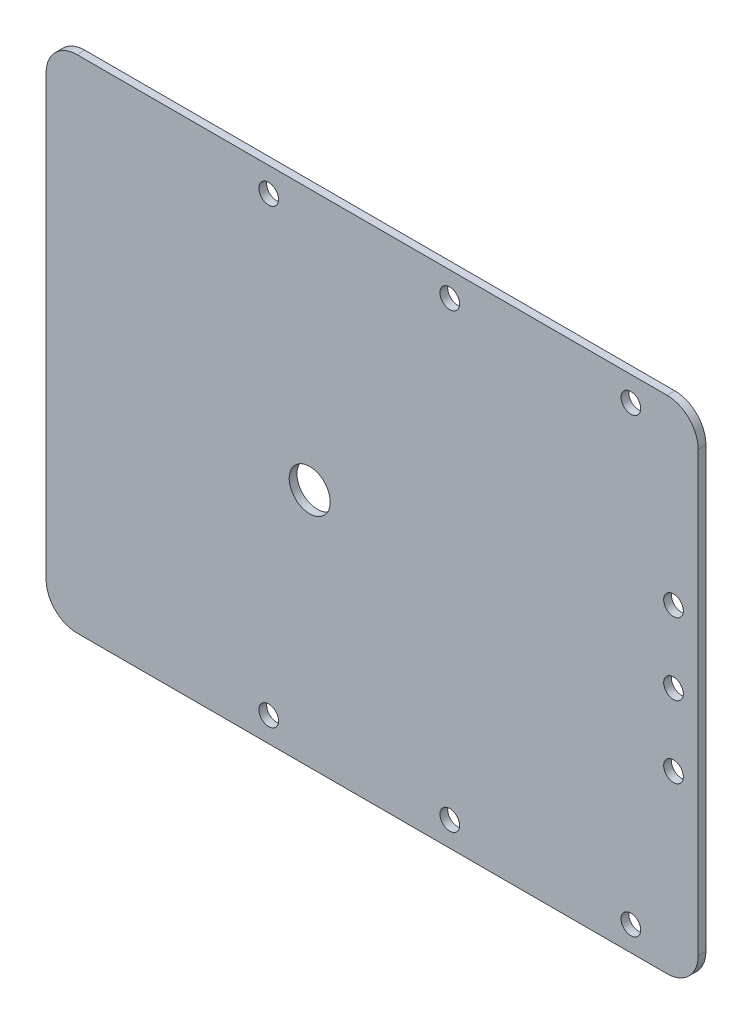
ISO-10303-21;
HEADER;
FILE_DESCRIPTION(('STEP AP214'),'2;1');
FILE_NAME('part.step','',(''),(''),'','','');
FILE_SCHEMA(('AUTOMOTIVE_DESIGN { 1 0 10303 214 1 1 1 1 }'));
ENDSEC;
DATA;
#1=APPLICATION_CONTEXT('core data for automotive mechanical design processes');
#2=APPLICATION_PROTOCOL_DEFINITION('international standard','automotive_design',2000,#1);
#3=PRODUCT_CONTEXT('',#1,'mechanical');
#4=PRODUCT('Part','Part','',(#3));
#5=PRODUCT_RELATED_PRODUCT_CATEGORY('part','',(#4));
#6=PRODUCT_DEFINITION_FORMATION('','',#4);
#7=PRODUCT_DEFINITION_CONTEXT('part definition',#1,'design');
#8=PRODUCT_DEFINITION('design','',#6,#7);
#9=PRODUCT_DEFINITION_SHAPE('','',#8);
#10=(LENGTH_UNIT() NAMED_UNIT(*) SI_UNIT(.MILLI.,.METRE.));
#11=(NAMED_UNIT(*) PLANE_ANGLE_UNIT() SI_UNIT($,.RADIAN.));
#12=(NAMED_UNIT(*) SI_UNIT($,.STERADIAN.) SOLID_ANGLE_UNIT());
#13=UNCERTAINTY_MEASURE_WITH_UNIT(LENGTH_MEASURE(1.E-05),#10,'distance_accuracy_value','');
#14=(GEOMETRIC_REPRESENTATION_CONTEXT(3) GLOBAL_UNCERTAINTY_ASSIGNED_CONTEXT((#13)) GLOBAL_UNIT_ASSIGNED_CONTEXT((#10,
#11,#12)) REPRESENTATION_CONTEXT('',''));
#15=CARTESIAN_POINT('',(0.,0.,0.));
#16=DIRECTION('',(0.,0.,1.));
#17=DIRECTION('',(1.,0.,0.));
#18=AXIS2_PLACEMENT_3D('',#15,#16,#17);
#19=CARTESIAN_POINT('',(59.5125,-52.775,1.5));
#20=DIRECTION('',(0.,0.,1.));
#21=DIRECTION('',(1.,0.,0.));
#22=AXIS2_PLACEMENT_3D('',#19,#20,#21);
#23=CYLINDRICAL_SURFACE('',#22,1.89864999999999);
#24=CARTESIAN_POINT('',(59.5125,-52.775,0.));
#25=DIRECTION('',(0.,0.,1.));
#26=DIRECTION('',(1.,0.,0.));
#27=AXIS2_PLACEMENT_3D('',#24,#25,#26);
#28=CIRCLE('',#27,1.89865);
#29=CARTESIAN_POINT('',(61.41115,-52.775,0.));
#30=VERTEX_POINT('',#29);
#31=EDGE_CURVE('E157',#30,#30,#28,.T.);
#32=ORIENTED_EDGE('',*,*,#31,.F.);
#33=EDGE_LOOP('',(#32));
#34=FACE_BOUND('',#33,.T.);
#35=CARTESIAN_POINT('',(59.5125,-52.775,1.5));
#36=DIRECTION('',(0.,0.,1.));
#37=DIRECTION('',(1.,0.,0.));
#38=AXIS2_PLACEMENT_3D('',#35,#36,#37);
#39=CIRCLE('',#38,1.89864999999999);
#40=CARTESIAN_POINT('',(61.41115,-52.775,1.5));
#41=VERTEX_POINT('',#40);
#42=EDGE_CURVE('E497',#41,#41,#39,.T.);
#43=ORIENTED_EDGE('',*,*,#42,.T.);
#44=EDGE_LOOP('',(#43));
#45=FACE_BOUND('',#44,.T.);
#46=ADVANCED_FACE('F39',(#34,#45),#23,.F.);
#47=CARTESIAN_POINT('',(-18.725,4.7625,1.5));
#48=DIRECTION('',(0.,0.,1.));
#49=DIRECTION('',(1.,0.,0.));
#50=AXIS2_PLACEMENT_3D('',#47,#48,#49);
#51=CYLINDRICAL_SURFACE('',#50,1.89864999999999);
#52=CARTESIAN_POINT('',(-18.725,4.7625,0.));
#53=DIRECTION('',(0.,0.,1.));
#54=DIRECTION('',(1.,0.,0.));
#55=AXIS2_PLACEMENT_3D('',#52,#53,#54);
#56=CIRCLE('',#55,1.89865);
#57=CARTESIAN_POINT('',(-16.82635,4.7625,0.));
#58=VERTEX_POINT('',#57);
#59=EDGE_CURVE('E150',#58,#58,#56,.T.);
#60=ORIENTED_EDGE('',*,*,#59,.F.);
#61=EDGE_LOOP('',(#60));
#62=FACE_BOUND('',#61,.T.);
#63=CARTESIAN_POINT('',(-18.725,4.7625,1.5));
#64=DIRECTION('',(0.,0.,1.));
#65=DIRECTION('',(1.,0.,0.));
#66=AXIS2_PLACEMENT_3D('',#63,#64,#65);
#67=CIRCLE('',#66,1.89864999999999);
#68=CARTESIAN_POINT('',(-16.82635,4.7625,1.5));
#69=VERTEX_POINT('',#68);
#70=EDGE_CURVE('E153',#69,#69,#67,.T.);
#71=ORIENTED_EDGE('',*,*,#70,.T.);
#72=EDGE_LOOP('',(#71));
#73=FACE_BOUND('',#72,.T.);
#74=ADVANCED_FACE('F300',(#62,#73),#51,.F.);
#75=CARTESIAN_POINT('',(-61.75,9.525,1.5));
#76=DIRECTION('',(1.,0.,0.));
#77=DIRECTION('',(0.,0.,-1.));
#78=AXIS2_PLACEMENT_3D('',#75,#76,#77);
#79=PLANE('',#78);
#80=DIRECTION('',(0.,-1.,0.));
#81=VECTOR('',#80,1.);
#82=CARTESIAN_POINT('',(-61.75,9.525,1.5));
#83=LINE('',#82,#81);
#84=CARTESIAN_POINT('',(-61.75,3.525,1.5));
#85=VERTEX_POINT('',#84);
#86=CARTESIAN_POINT('',(-61.75,-81.3,1.5));
#87=VERTEX_POINT('',#86);
#88=EDGE_CURVE('E125',#85,#87,#83,.T.);
#89=ORIENTED_EDGE('',*,*,#88,.F.);
#90=DIRECTION('',(0.,0.,-1.));
#91=VECTOR('',#90,1.);
#92=CARTESIAN_POINT('',(-61.75,3.525,1.5));
#93=LINE('',#92,#91);
#94=CARTESIAN_POINT('',(-61.75,3.525,0.));
#95=VERTEX_POINT('',#94);
#96=EDGE_CURVE('E109',#85,#95,#93,.T.);
#97=ORIENTED_EDGE('',*,*,#96,.T.);
#98=DIRECTION('',(0.,-1.,0.));
#99=VECTOR('',#98,1.);
#100=CARTESIAN_POINT('',(-61.75,9.525,0.));
#101=LINE('',#100,#99);
#102=CARTESIAN_POINT('',(-61.75,-81.3,0.));
#103=VERTEX_POINT('',#102);
#104=EDGE_CURVE('E122',#95,#103,#101,.T.);
#105=ORIENTED_EDGE('',*,*,#104,.T.);
#106=DIRECTION('',(0.,0.,-1.));
#107=VECTOR('',#106,1.);
#108=CARTESIAN_POINT('',(-61.75,-81.3,1.5));
#109=LINE('',#108,#107);
#110=EDGE_CURVE('E127',#103,#87,#109,.F.);
#111=ORIENTED_EDGE('',*,*,#110,.T.);
#112=EDGE_LOOP('',(#89,#97,#105,#111));
#113=FACE_BOUND('',#112,.T.);
#114=ADVANCED_FACE('F121',(#113),#79,.F.);
#115=CARTESIAN_POINT('',(-61.75,-87.3,1.5));
#116=DIRECTION('',(0.,1.,0.));
#117=DIRECTION('',(0.,0.,1.));
#118=AXIS2_PLACEMENT_3D('',#115,#116,#117);
#119=PLANE('',#118);
#120=DIRECTION('',(1.,0.,0.));
#121=VECTOR('',#120,1.);
#122=CARTESIAN_POINT('',(-61.75,-87.3,0.));
#123=LINE('',#122,#121);
#124=CARTESIAN_POINT('',(-55.75,-87.3,0.));
#125=VERTEX_POINT('',#124);
#126=CARTESIAN_POINT('',(58.275,-87.3,0.));
#127=VERTEX_POINT('',#126);
#128=EDGE_CURVE('E133',#125,#127,#123,.T.);
#129=ORIENTED_EDGE('',*,*,#128,.T.);
#130=DIRECTION('',(0.,0.,-1.));
#131=VECTOR('',#130,1.);
#132=CARTESIAN_POINT('',(58.275,-87.3,1.5));
#133=LINE('',#132,#131);
#134=CARTESIAN_POINT('',(58.275,-87.3,1.5));
#135=VERTEX_POINT('',#134);
#136=EDGE_CURVE('E12',#127,#135,#133,.F.);
#137=ORIENTED_EDGE('',*,*,#136,.T.);
#138=DIRECTION('',(1.,0.,0.));
#139=VECTOR('',#138,1.);
#140=CARTESIAN_POINT('',(-61.75,-87.3,1.5));
#141=LINE('',#140,#139);
#142=CARTESIAN_POINT('',(-55.75,-87.3,1.5));
#143=VERTEX_POINT('',#142);
#144=EDGE_CURVE('E178',#143,#135,#141,.T.);
#145=ORIENTED_EDGE('',*,*,#144,.F.);
#146=DIRECTION('',(0.,0.,-1.));
#147=VECTOR('',#146,1.);
#148=CARTESIAN_POINT('',(-55.75,-87.3,1.5));
#149=LINE('',#148,#147);
#150=EDGE_CURVE('E47',#143,#125,#149,.T.);
#151=ORIENTED_EDGE('',*,*,#150,.T.);
#152=EDGE_LOOP('',(#129,#137,#145,#151));
#153=FACE_BOUND('',#152,.T.);
#154=ADVANCED_FACE('F330',(#153),#119,.F.);
#155=CARTESIAN_POINT('',(64.275,9.525,1.5));
#156=DIRECTION('',(-1.,0.,0.));
#157=DIRECTION('',(0.,0.,1.));
#158=AXIS2_PLACEMENT_3D('',#155,#156,#157);
#159=PLANE('',#158);
#160=DIRECTION('',(0.,1.,0.));
#161=VECTOR('',#160,1.);
#162=CARTESIAN_POINT('',(64.275,9.525,1.5));
#163=LINE('',#162,#161);
#164=CARTESIAN_POINT('',(64.275,-81.3,1.5));
#165=VERTEX_POINT('',#164);
#166=CARTESIAN_POINT('',(64.275,3.525,1.5));
#167=VERTEX_POINT('',#166);
#168=EDGE_CURVE('E180',#165,#167,#163,.T.);
#169=ORIENTED_EDGE('',*,*,#168,.F.);
#170=DIRECTION('',(0.,0.,-1.));
#171=VECTOR('',#170,1.);
#172=CARTESIAN_POINT('',(64.275,-81.3,1.5));
#173=LINE('',#172,#171);
#174=CARTESIAN_POINT('',(64.275,-81.3,0.));
#175=VERTEX_POINT('',#174);
#176=EDGE_CURVE('E192',#165,#175,#173,.T.);
#177=ORIENTED_EDGE('',*,*,#176,.T.);
#178=DIRECTION('',(0.,1.,0.));
#179=VECTOR('',#178,1.);
#180=CARTESIAN_POINT('',(64.275,9.525,0.));
#181=LINE('',#180,#179);
#182=CARTESIAN_POINT('',(64.275,3.525,0.));
#183=VERTEX_POINT('',#182);
#184=EDGE_CURVE('E137',#175,#183,#181,.T.);
#185=ORIENTED_EDGE('',*,*,#184,.T.);
#186=DIRECTION('',(0.,0.,-1.));
#187=VECTOR('',#186,1.);
#188=CARTESIAN_POINT('',(64.275,3.525,1.5));
#189=LINE('',#188,#187);
#190=EDGE_CURVE('E54',#183,#167,#189,.F.);
#191=ORIENTED_EDGE('',*,*,#190,.T.);
#192=EDGE_LOOP('',(#169,#177,#185,#191));
#193=FACE_BOUND('',#192,.T.);
#194=ADVANCED_FACE('F335',(#193),#159,.F.);
#195=CARTESIAN_POINT('',(-61.75,9.525,1.5));
#196=DIRECTION('',(0.,-1.,0.));
#197=DIRECTION('',(0.,0.,-1.));
#198=AXIS2_PLACEMENT_3D('',#195,#196,#197);
#199=PLANE('',#198);
#200=DIRECTION('',(-1.,0.,0.));
#201=VECTOR('',#200,1.);
#202=CARTESIAN_POINT('',(-61.75,9.525,0.));
#203=LINE('',#202,#201);
#204=CARTESIAN_POINT('',(58.275,9.525,0.));
#205=VERTEX_POINT('',#204);
#206=CARTESIAN_POINT('',(-55.75,9.525,0.));
#207=VERTEX_POINT('',#206);
#208=EDGE_CURVE('E148',#205,#207,#203,.T.);
#209=ORIENTED_EDGE('',*,*,#208,.T.);
#210=DIRECTION('',(0.,0.,-1.));
#211=VECTOR('',#210,1.);
#212=CARTESIAN_POINT('',(-55.75,9.525,1.5));
#213=LINE('',#212,#211);
#214=CARTESIAN_POINT('',(-55.75,9.525,1.5));
#215=VERTEX_POINT('',#214);
#216=EDGE_CURVE('E110',#207,#215,#213,.F.);
#217=ORIENTED_EDGE('',*,*,#216,.T.);
#218=DIRECTION('',(-1.,0.,0.));
#219=VECTOR('',#218,1.);
#220=CARTESIAN_POINT('',(-61.75,9.525,1.5));
#221=LINE('',#220,#219);
#222=CARTESIAN_POINT('',(58.275,9.525,1.5));
#223=VERTEX_POINT('',#222);
#224=EDGE_CURVE('E143',#223,#215,#221,.T.);
#225=ORIENTED_EDGE('',*,*,#224,.F.);
#226=DIRECTION('',(0.,0.,-1.));
#227=VECTOR('',#226,1.);
#228=CARTESIAN_POINT('',(58.275,9.525,1.5));
#229=LINE('',#228,#227);
#230=EDGE_CURVE('E115',#223,#205,#229,.T.);
#231=ORIENTED_EDGE('',*,*,#230,.T.);
#232=EDGE_LOOP('',(#209,#217,#225,#231));
#233=FACE_BOUND('',#232,.T.);
#234=ADVANCED_FACE('F269',(#233),#199,.F.);
#235=CARTESIAN_POINT('',(0.,0.,1.5));
#236=DIRECTION('',(0.,0.,1.));
#237=DIRECTION('',(1.,0.,0.));
#238=AXIS2_PLACEMENT_3D('',#235,#236,#237);
#239=PLANE('',#238);
#240=CARTESIAN_POINT('',(-10.8009468969028,-40.887521779848,1.5));
#241=DIRECTION('',(0.,0.,1.));
#242=DIRECTION('',(1.,0.,0.));
#243=AXIS2_PLACEMENT_3D('',#240,#241,#242);
#244=CIRCLE('',#243,3.9624);
#245=CARTESIAN_POINT('',(-6.83854689690276,-40.887521779848,1.5));
#246=VERTEX_POINT('',#245);
#247=EDGE_CURVE('E247',#246,#246,#244,.T.);
#248=ORIENTED_EDGE('',*,*,#247,.F.);
#249=EDGE_LOOP('',(#248));
#250=FACE_BOUND('',#249,.T.);
#251=CARTESIAN_POINT('',(59.5125,-38.8875,1.5));
#252=DIRECTION('',(0.,0.,1.));
#253=DIRECTION('',(1.,0.,0.));
#254=AXIS2_PLACEMENT_3D('',#251,#252,#253);
#255=CIRCLE('',#254,1.89864999999999);
#256=CARTESIAN_POINT('',(61.41115,-38.8875,1.5));
#257=VERTEX_POINT('',#256);
#258=EDGE_CURVE('E241',#257,#257,#255,.T.);
#259=ORIENTED_EDGE('',*,*,#258,.F.);
#260=EDGE_LOOP('',(#259));
#261=FACE_BOUND('',#260,.T.);
#262=CARTESIAN_POINT('',(59.5125,-25.,1.5));
#263=DIRECTION('',(0.,0.,1.));
#264=DIRECTION('',(1.,0.,0.));
#265=AXIS2_PLACEMENT_3D('',#262,#263,#264);
#266=CIRCLE('',#265,1.89864999999999);
#267=CARTESIAN_POINT('',(61.41115,-25.,1.5));
#268=VERTEX_POINT('',#267);
#269=EDGE_CURVE('E237',#268,#268,#266,.T.);
#270=ORIENTED_EDGE('',*,*,#269,.F.);
#271=EDGE_LOOP('',(#270));
#272=FACE_BOUND('',#271,.T.);
#273=CARTESIAN_POINT('',(-18.725,-82.5375,1.5));
#274=DIRECTION('',(0.,0.,1.));
#275=DIRECTION('',(1.,0.,0.));
#276=AXIS2_PLACEMENT_3D('',#273,#274,#275);
#277=CIRCLE('',#276,1.89864999999999);
#278=CARTESIAN_POINT('',(-16.82635,-82.5375,1.5));
#279=VERTEX_POINT('',#278);
#280=EDGE_CURVE('E230',#279,#279,#277,.T.);
#281=ORIENTED_EDGE('',*,*,#280,.F.);
#282=EDGE_LOOP('',(#281));
#283=FACE_BOUND('',#282,.T.);
#284=CARTESIAN_POINT('',(16.275,-82.5375,1.5));
#285=DIRECTION('',(0.,0.,1.));
#286=DIRECTION('',(1.,0.,0.));
#287=AXIS2_PLACEMENT_3D('',#284,#285,#286);
#288=CIRCLE('',#287,1.89864999999999);
#289=CARTESIAN_POINT('',(18.17365,-82.5375,1.5));
#290=VERTEX_POINT('',#289);
#291=EDGE_CURVE('E224',#290,#290,#288,.T.);
#292=ORIENTED_EDGE('',*,*,#291,.F.);
#293=EDGE_LOOP('',(#292));
#294=FACE_BOUND('',#293,.T.);
#295=CARTESIAN_POINT('',(51.275,-82.5375,1.5));
#296=DIRECTION('',(0.,0.,1.));
#297=DIRECTION('',(1.,0.,0.));
#298=AXIS2_PLACEMENT_3D('',#295,#296,#297);
#299=CIRCLE('',#298,1.89864999999999);
#300=CARTESIAN_POINT('',(53.17365,-82.5375,1.5));
#301=VERTEX_POINT('',#300);
#302=EDGE_CURVE('E214',#301,#301,#299,.T.);
#303=ORIENTED_EDGE('',*,*,#302,.F.);
#304=EDGE_LOOP('',(#303));
#305=FACE_BOUND('',#304,.T.);
#306=CARTESIAN_POINT('',(16.275,4.7625,1.5));
#307=DIRECTION('',(0.,0.,1.));
#308=DIRECTION('',(1.,0.,0.));
#309=AXIS2_PLACEMENT_3D('',#306,#307,#308);
#310=CIRCLE('',#309,1.89864999999999);
#311=CARTESIAN_POINT('',(18.17365,4.7625,1.5));
#312=VERTEX_POINT('',#311);
#313=EDGE_CURVE('E204',#312,#312,#310,.T.);
#314=ORIENTED_EDGE('',*,*,#313,.F.);
#315=EDGE_LOOP('',(#314));
#316=FACE_BOUND('',#315,.T.);
#317=CARTESIAN_POINT('',(51.275,4.7625,1.5));
#318=DIRECTION('',(0.,0.,1.));
#319=DIRECTION('',(1.,0.,0.));
#320=AXIS2_PLACEMENT_3D('',#317,#318,#319);
#321=CIRCLE('',#320,1.89864999999999);
#322=CARTESIAN_POINT('',(53.17365,4.7625,1.5));
#323=VERTEX_POINT('',#322);
#324=EDGE_CURVE('E140',#323,#323,#321,.T.);
#325=ORIENTED_EDGE('',*,*,#324,.F.);
#326=EDGE_LOOP('',(#325));
#327=FACE_BOUND('',#326,.T.);
#328=ORIENTED_EDGE('',*,*,#224,.T.);
#329=CARTESIAN_POINT('',(-55.75,3.525,1.5));
#330=DIRECTION('',(0.,0.,1.));
#331=DIRECTION('',(1.,0.,0.));
#332=AXIS2_PLACEMENT_3D('',#329,#330,#331);
#333=CIRCLE('',#332,6.);
#334=EDGE_CURVE('E188',#215,#85,#333,.T.);
#335=ORIENTED_EDGE('',*,*,#334,.T.);
#336=ORIENTED_EDGE('',*,*,#88,.T.);
#337=CARTESIAN_POINT('',(-55.75,-81.3,1.5));
#338=DIRECTION('',(0.,0.,1.));
#339=DIRECTION('',(1.,0.,0.));
#340=AXIS2_PLACEMENT_3D('',#337,#338,#339);
#341=CIRCLE('',#340,6.);
#342=EDGE_CURVE('E166',#87,#143,#341,.T.);
#343=ORIENTED_EDGE('',*,*,#342,.T.);
#344=ORIENTED_EDGE('',*,*,#144,.T.);
#345=CARTESIAN_POINT('',(58.275,-81.3,1.5));
#346=DIRECTION('',(0.,0.,1.));
#347=DIRECTION('',(1.,0.,0.));
#348=AXIS2_PLACEMENT_3D('',#345,#346,#347);
#349=CIRCLE('',#348,6.);
#350=EDGE_CURVE('E61',#135,#165,#349,.T.);
#351=ORIENTED_EDGE('',*,*,#350,.T.);
#352=ORIENTED_EDGE('',*,*,#168,.T.);
#353=CARTESIAN_POINT('',(58.275,3.525,1.5));
#354=DIRECTION('',(0.,0.,1.));
#355=DIRECTION('',(1.,0.,0.));
#356=AXIS2_PLACEMENT_3D('',#353,#354,#355);
#357=CIRCLE('',#356,6.);
#358=EDGE_CURVE('E162',#167,#223,#357,.T.);
#359=ORIENTED_EDGE('',*,*,#358,.T.);
#360=EDGE_LOOP('',(#328,#335,#336,#343,#344,#351,#352,#359));
#361=FACE_BOUND('',#360,.T.);
#362=ORIENTED_EDGE('',*,*,#70,.F.);
#363=EDGE_LOOP('',(#362));
#364=FACE_BOUND('',#363,.T.);
#365=ORIENTED_EDGE('',*,*,#42,.F.);
#366=EDGE_LOOP('',(#365));
#367=FACE_BOUND('',#366,.T.);
#368=ADVANCED_FACE('F186',(#250,#261,#272,#283,#294,#305,#316,#327,#361,#364,#367),#239,.T.);
#369=CARTESIAN_POINT('',(0.,0.,0.));
#370=DIRECTION('',(0.,0.,1.));
#371=DIRECTION('',(1.,0.,0.));
#372=AXIS2_PLACEMENT_3D('',#369,#370,#371);
#373=PLANE('',#372);
#374=CARTESIAN_POINT('',(-10.8009468969028,-40.887521779848,0.));
#375=DIRECTION('',(0.,0.,1.));
#376=DIRECTION('',(1.,0.,0.));
#377=AXIS2_PLACEMENT_3D('',#374,#375,#376);
#378=CIRCLE('',#377,3.9624);
#379=CARTESIAN_POINT('',(-6.83854689690276,-40.887521779848,0.));
#380=VERTEX_POINT('',#379);
#381=EDGE_CURVE('E251',#380,#380,#378,.T.);
#382=ORIENTED_EDGE('',*,*,#381,.T.);
#383=EDGE_LOOP('',(#382));
#384=FACE_BOUND('',#383,.T.);
#385=CARTESIAN_POINT('',(59.5125,-38.8875,0.));
#386=DIRECTION('',(0.,0.,1.));
#387=DIRECTION('',(1.,0.,0.));
#388=AXIS2_PLACEMENT_3D('',#385,#386,#387);
#389=CIRCLE('',#388,1.89865);
#390=CARTESIAN_POINT('',(61.41115,-38.8875,0.));
#391=VERTEX_POINT('',#390);
#392=EDGE_CURVE('E252',#391,#391,#389,.T.);
#393=ORIENTED_EDGE('',*,*,#392,.T.);
#394=EDGE_LOOP('',(#393));
#395=FACE_BOUND('',#394,.T.);
#396=CARTESIAN_POINT('',(59.5125,-25.,0.));
#397=DIRECTION('',(0.,0.,1.));
#398=DIRECTION('',(1.,0.,0.));
#399=AXIS2_PLACEMENT_3D('',#396,#397,#398);
#400=CIRCLE('',#399,1.89865);
#401=CARTESIAN_POINT('',(61.41115,-25.,0.));
#402=VERTEX_POINT('',#401);
#403=EDGE_CURVE('E234',#402,#402,#400,.T.);
#404=ORIENTED_EDGE('',*,*,#403,.T.);
#405=EDGE_LOOP('',(#404));
#406=FACE_BOUND('',#405,.T.);
#407=CARTESIAN_POINT('',(-18.725,-82.5375,0.));
#408=DIRECTION('',(0.,0.,1.));
#409=DIRECTION('',(1.,0.,0.));
#410=AXIS2_PLACEMENT_3D('',#407,#408,#409);
#411=CIRCLE('',#410,1.89865);
#412=CARTESIAN_POINT('',(-16.82635,-82.5375,0.));
#413=VERTEX_POINT('',#412);
#414=EDGE_CURVE('E228',#413,#413,#411,.T.);
#415=ORIENTED_EDGE('',*,*,#414,.T.);
#416=EDGE_LOOP('',(#415));
#417=FACE_BOUND('',#416,.T.);
#418=CARTESIAN_POINT('',(16.275,-82.5375,0.));
#419=DIRECTION('',(0.,0.,1.));
#420=DIRECTION('',(1.,0.,0.));
#421=AXIS2_PLACEMENT_3D('',#418,#419,#420);
#422=CIRCLE('',#421,1.89865);
#423=CARTESIAN_POINT('',(18.17365,-82.5375,0.));
#424=VERTEX_POINT('',#423);
#425=EDGE_CURVE('E218',#424,#424,#422,.T.);
#426=ORIENTED_EDGE('',*,*,#425,.T.);
#427=EDGE_LOOP('',(#426));
#428=FACE_BOUND('',#427,.T.);
#429=CARTESIAN_POINT('',(51.275,-82.5375,0.));
#430=DIRECTION('',(0.,0.,1.));
#431=DIRECTION('',(1.,0.,0.));
#432=AXIS2_PLACEMENT_3D('',#429,#430,#431);
#433=CIRCLE('',#432,1.89865);
#434=CARTESIAN_POINT('',(53.17365,-82.5375,0.));
#435=VERTEX_POINT('',#434);
#436=EDGE_CURVE('E211',#435,#435,#433,.T.);
#437=ORIENTED_EDGE('',*,*,#436,.T.);
#438=EDGE_LOOP('',(#437));
#439=FACE_BOUND('',#438,.T.);
#440=CARTESIAN_POINT('',(16.275,4.7625,0.));
#441=DIRECTION('',(0.,0.,1.));
#442=DIRECTION('',(1.,0.,0.));
#443=AXIS2_PLACEMENT_3D('',#440,#441,#442);
#444=CIRCLE('',#443,1.89865);
#445=CARTESIAN_POINT('',(18.17365,4.7625,0.));
#446=VERTEX_POINT('',#445);
#447=EDGE_CURVE('E208',#446,#446,#444,.T.);
#448=ORIENTED_EDGE('',*,*,#447,.T.);
#449=EDGE_LOOP('',(#448));
#450=FACE_BOUND('',#449,.T.);
#451=CARTESIAN_POINT('',(51.275,4.7625,0.));
#452=DIRECTION('',(0.,0.,1.));
#453=DIRECTION('',(1.,0.,0.));
#454=AXIS2_PLACEMENT_3D('',#451,#452,#453);
#455=CIRCLE('',#454,1.89865);
#456=CARTESIAN_POINT('',(53.17365,4.7625,0.));
#457=VERTEX_POINT('',#456);
#458=EDGE_CURVE('E134',#457,#457,#455,.T.);
#459=ORIENTED_EDGE('',*,*,#458,.T.);
#460=EDGE_LOOP('',(#459));
#461=FACE_BOUND('',#460,.T.);
#462=ORIENTED_EDGE('',*,*,#104,.F.);
#463=CARTESIAN_POINT('',(-55.75,3.525,0.));
#464=DIRECTION('',(0.,0.,1.));
#465=DIRECTION('',(1.,0.,0.));
#466=AXIS2_PLACEMENT_3D('',#463,#464,#465);
#467=CIRCLE('',#466,6.);
#468=EDGE_CURVE('E105',#95,#207,#467,.F.);
#469=ORIENTED_EDGE('',*,*,#468,.T.);
#470=ORIENTED_EDGE('',*,*,#208,.F.);
#471=CARTESIAN_POINT('',(58.275,3.525,0.));
#472=DIRECTION('',(0.,0.,1.));
#473=DIRECTION('',(1.,0.,0.));
#474=AXIS2_PLACEMENT_3D('',#471,#472,#473);
#475=CIRCLE('',#474,6.);
#476=EDGE_CURVE('E126',#205,#183,#475,.F.);
#477=ORIENTED_EDGE('',*,*,#476,.T.);
#478=ORIENTED_EDGE('',*,*,#184,.F.);
#479=CARTESIAN_POINT('',(58.275,-81.3,0.));
#480=DIRECTION('',(0.,0.,1.));
#481=DIRECTION('',(1.,0.,0.));
#482=AXIS2_PLACEMENT_3D('',#479,#480,#481);
#483=CIRCLE('',#482,6.);
#484=EDGE_CURVE('E116',#175,#127,#483,.F.);
#485=ORIENTED_EDGE('',*,*,#484,.T.);
#486=ORIENTED_EDGE('',*,*,#128,.F.);
#487=CARTESIAN_POINT('',(-55.75,-81.3,0.));
#488=DIRECTION('',(0.,0.,1.));
#489=DIRECTION('',(1.,0.,0.));
#490=AXIS2_PLACEMENT_3D('',#487,#488,#489);
#491=CIRCLE('',#490,6.);
#492=EDGE_CURVE('E132',#125,#103,#491,.F.);
#493=ORIENTED_EDGE('',*,*,#492,.T.);
#494=EDGE_LOOP('',(#462,#469,#470,#477,#478,#485,#486,#493));
#495=FACE_BOUND('',#494,.T.);
#496=ORIENTED_EDGE('',*,*,#59,.T.);
#497=EDGE_LOOP('',(#496));
#498=FACE_BOUND('',#497,.T.);
#499=ORIENTED_EDGE('',*,*,#31,.T.);
#500=EDGE_LOOP('',(#499));
#501=FACE_BOUND('',#500,.T.);
#502=ADVANCED_FACE('F129',(#384,#395,#406,#417,#428,#439,#450,#461,#495,#498,#501),#373,.F.);
#503=CARTESIAN_POINT('',(51.275,4.7625,1.5));
#504=DIRECTION('',(0.,0.,1.));
#505=DIRECTION('',(1.,0.,0.));
#506=AXIS2_PLACEMENT_3D('',#503,#504,#505);
#507=CYLINDRICAL_SURFACE('',#506,1.89864999999999);
#508=ORIENTED_EDGE('',*,*,#458,.F.);
#509=EDGE_LOOP('',(#508));
#510=FACE_BOUND('',#509,.T.);
#511=ORIENTED_EDGE('',*,*,#324,.T.);
#512=EDGE_LOOP('',(#511));
#513=FACE_BOUND('',#512,.T.);
#514=ADVANCED_FACE('F285',(#510,#513),#507,.F.);
#515=CARTESIAN_POINT('',(16.275,4.7625,1.5));
#516=DIRECTION('',(0.,0.,1.));
#517=DIRECTION('',(1.,0.,0.));
#518=AXIS2_PLACEMENT_3D('',#515,#516,#517);
#519=CYLINDRICAL_SURFACE('',#518,1.89864999999999);
#520=ORIENTED_EDGE('',*,*,#447,.F.);
#521=EDGE_LOOP('',(#520));
#522=FACE_BOUND('',#521,.T.);
#523=ORIENTED_EDGE('',*,*,#313,.T.);
#524=EDGE_LOOP('',(#523));
#525=FACE_BOUND('',#524,.T.);
#526=ADVANCED_FACE('F287',(#522,#525),#519,.F.);
#527=CARTESIAN_POINT('',(51.275,-82.5375,1.5));
#528=DIRECTION('',(0.,0.,1.));
#529=DIRECTION('',(1.,0.,0.));
#530=AXIS2_PLACEMENT_3D('',#527,#528,#529);
#531=CYLINDRICAL_SURFACE('',#530,1.89864999999999);
#532=ORIENTED_EDGE('',*,*,#436,.F.);
#533=EDGE_LOOP('',(#532));
#534=FACE_BOUND('',#533,.T.);
#535=ORIENTED_EDGE('',*,*,#302,.T.);
#536=EDGE_LOOP('',(#535));
#537=FACE_BOUND('',#536,.T.);
#538=ADVANCED_FACE('F294',(#534,#537),#531,.F.);
#539=CARTESIAN_POINT('',(16.275,-82.5375,1.5));
#540=DIRECTION('',(0.,0.,1.));
#541=DIRECTION('',(1.,0.,0.));
#542=AXIS2_PLACEMENT_3D('',#539,#540,#541);
#543=CYLINDRICAL_SURFACE('',#542,1.89864999999999);
#544=ORIENTED_EDGE('',*,*,#425,.F.);
#545=EDGE_LOOP('',(#544));
#546=FACE_BOUND('',#545,.T.);
#547=ORIENTED_EDGE('',*,*,#291,.T.);
#548=EDGE_LOOP('',(#547));
#549=FACE_BOUND('',#548,.T.);
#550=ADVANCED_FACE('F431',(#546,#549),#543,.F.);
#551=CARTESIAN_POINT('',(-18.725,-82.5375,1.5));
#552=DIRECTION('',(0.,0.,1.));
#553=DIRECTION('',(1.,0.,0.));
#554=AXIS2_PLACEMENT_3D('',#551,#552,#553);
#555=CYLINDRICAL_SURFACE('',#554,1.89864999999999);
#556=ORIENTED_EDGE('',*,*,#414,.F.);
#557=EDGE_LOOP('',(#556));
#558=FACE_BOUND('',#557,.T.);
#559=ORIENTED_EDGE('',*,*,#280,.T.);
#560=EDGE_LOOP('',(#559));
#561=FACE_BOUND('',#560,.T.);
#562=ADVANCED_FACE('F440',(#558,#561),#555,.F.);
#563=CARTESIAN_POINT('',(59.5125,-25.,1.5));
#564=DIRECTION('',(0.,0.,1.));
#565=DIRECTION('',(1.,0.,0.));
#566=AXIS2_PLACEMENT_3D('',#563,#564,#565);
#567=CYLINDRICAL_SURFACE('',#566,1.89864999999999);
#568=ORIENTED_EDGE('',*,*,#403,.F.);
#569=EDGE_LOOP('',(#568));
#570=FACE_BOUND('',#569,.T.);
#571=ORIENTED_EDGE('',*,*,#269,.T.);
#572=EDGE_LOOP('',(#571));
#573=FACE_BOUND('',#572,.T.);
#574=ADVANCED_FACE('F449',(#570,#573),#567,.F.);
#575=CARTESIAN_POINT('',(59.5125,-38.8875,1.5));
#576=DIRECTION('',(0.,0.,1.));
#577=DIRECTION('',(1.,0.,0.));
#578=AXIS2_PLACEMENT_3D('',#575,#576,#577);
#579=CYLINDRICAL_SURFACE('',#578,1.89864999999999);
#580=ORIENTED_EDGE('',*,*,#392,.F.);
#581=EDGE_LOOP('',(#580));
#582=FACE_BOUND('',#581,.T.);
#583=ORIENTED_EDGE('',*,*,#258,.T.);
#584=EDGE_LOOP('',(#583));
#585=FACE_BOUND('',#584,.T.);
#586=ADVANCED_FACE('F315',(#582,#585),#579,.F.);
#587=CARTESIAN_POINT('',(-55.75,3.525,1.5));
#588=DIRECTION('',(0.,0.,-1.));
#589=DIRECTION('',(-1.,0.,0.));
#590=AXIS2_PLACEMENT_3D('',#587,#588,#589);
#591=CYLINDRICAL_SURFACE('',#590,6.);
#592=ORIENTED_EDGE('',*,*,#334,.F.);
#593=ORIENTED_EDGE('',*,*,#216,.F.);
#594=ORIENTED_EDGE('',*,*,#468,.F.);
#595=ORIENTED_EDGE('',*,*,#96,.F.);
#596=EDGE_LOOP('',(#592,#593,#594,#595));
#597=FACE_BOUND('',#596,.T.);
#598=ADVANCED_FACE('F108',(#597),#591,.T.);
#599=CARTESIAN_POINT('',(58.275,-81.3,1.5));
#600=DIRECTION('',(0.,0.,-1.));
#601=DIRECTION('',(-1.,0.,0.));
#602=AXIS2_PLACEMENT_3D('',#599,#600,#601);
#603=CYLINDRICAL_SURFACE('',#602,6.);
#604=ORIENTED_EDGE('',*,*,#350,.F.);
#605=ORIENTED_EDGE('',*,*,#136,.F.);
#606=ORIENTED_EDGE('',*,*,#484,.F.);
#607=ORIENTED_EDGE('',*,*,#176,.F.);
#608=EDGE_LOOP('',(#604,#605,#606,#607));
#609=FACE_BOUND('',#608,.T.);
#610=ADVANCED_FACE('F314',(#609),#603,.T.);
#611=CARTESIAN_POINT('',(-55.75,-81.3,1.5));
#612=DIRECTION('',(0.,0.,-1.));
#613=DIRECTION('',(-1.,0.,0.));
#614=AXIS2_PLACEMENT_3D('',#611,#612,#613);
#615=CYLINDRICAL_SURFACE('',#614,6.);
#616=ORIENTED_EDGE('',*,*,#342,.F.);
#617=ORIENTED_EDGE('',*,*,#110,.F.);
#618=ORIENTED_EDGE('',*,*,#492,.F.);
#619=ORIENTED_EDGE('',*,*,#150,.F.);
#620=EDGE_LOOP('',(#616,#617,#618,#619));
#621=FACE_BOUND('',#620,.T.);
#622=ADVANCED_FACE('F317',(#621),#615,.T.);
#623=CARTESIAN_POINT('',(58.275,3.525,1.5));
#624=DIRECTION('',(0.,0.,-1.));
#625=DIRECTION('',(-1.,0.,0.));
#626=AXIS2_PLACEMENT_3D('',#623,#624,#625);
#627=CYLINDRICAL_SURFACE('',#626,6.);
#628=ORIENTED_EDGE('',*,*,#358,.F.);
#629=ORIENTED_EDGE('',*,*,#190,.F.);
#630=ORIENTED_EDGE('',*,*,#476,.F.);
#631=ORIENTED_EDGE('',*,*,#230,.F.);
#632=EDGE_LOOP('',(#628,#629,#630,#631));
#633=FACE_BOUND('',#632,.T.);
#634=ADVANCED_FACE('F41',(#633),#627,.T.);
#635=CARTESIAN_POINT('',(-10.8009468969028,-40.887521779848,0.));
#636=DIRECTION('',(0.,0.,1.));
#637=DIRECTION('',(1.,0.,0.));
#638=AXIS2_PLACEMENT_3D('',#635,#636,#637);
#639=CYLINDRICAL_SURFACE('',#638,3.9624);
#640=ORIENTED_EDGE('',*,*,#381,.F.);
#641=EDGE_LOOP('',(#640));
#642=FACE_BOUND('',#641,.T.);
#643=ORIENTED_EDGE('',*,*,#247,.T.);
#644=EDGE_LOOP('',(#643));
#645=FACE_BOUND('',#644,.T.);
#646=ADVANCED_FACE('F261',(#642,#645),#639,.F.);
#647=CLOSED_SHELL('',(#46,#74,#114,#154,#194,#234,#368,#502,#514,#526,#538,#550,#562,#574,#586,
#598,#610,#622,#634,#646));
#648=MANIFOLD_SOLID_BREP('B2',#647);
#649=ADVANCED_BREP_SHAPE_REPRESENTATION('',(#18,#648),#14);
#650=SHAPE_DEFINITION_REPRESENTATION(#9,#649);
ENDSEC;
END-ISO-10303-21;
